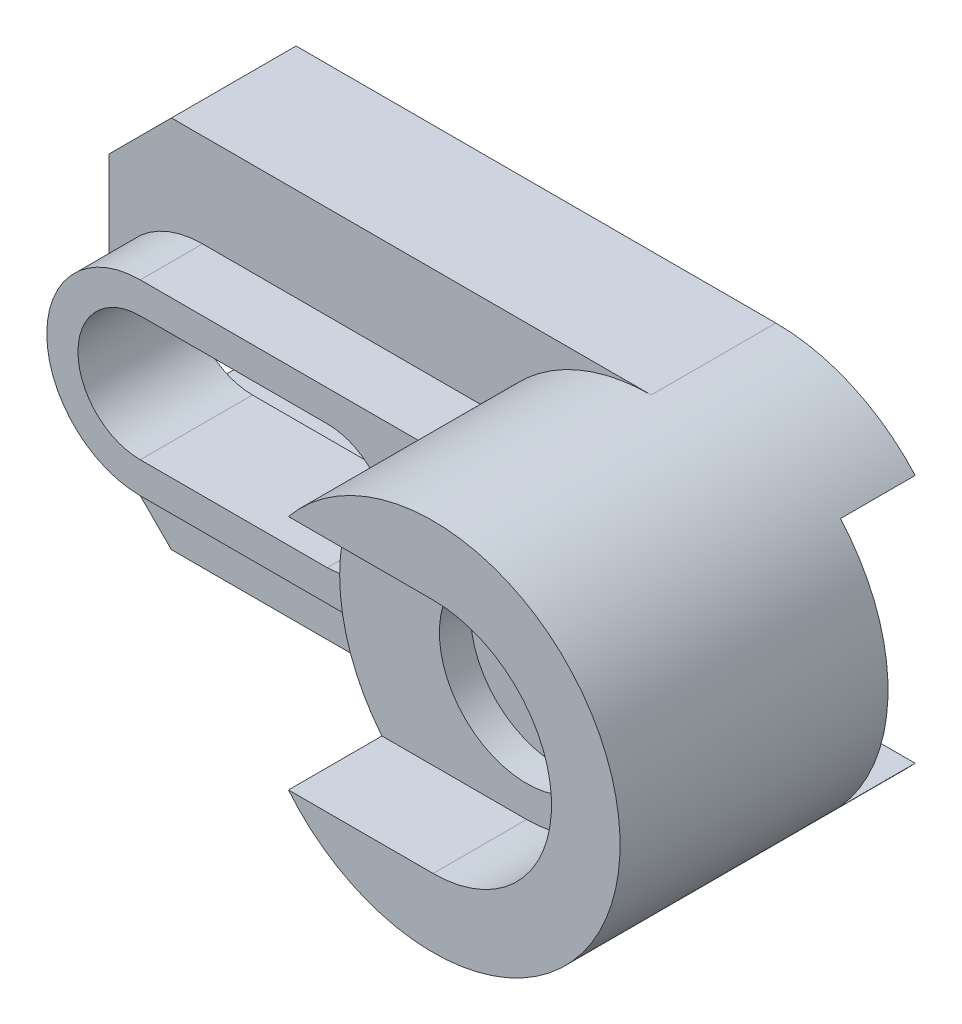
ISO-10303-21;
HEADER;
FILE_DESCRIPTION(('STEP AP214'),'2;1');
FILE_NAME('part.step','',(''),(''),'','','');
FILE_SCHEMA(('AUTOMOTIVE_DESIGN { 1 0 10303 214 1 1 1 1 }'));
ENDSEC;
DATA;
#1=APPLICATION_CONTEXT('core data for automotive mechanical design processes');
#2=APPLICATION_PROTOCOL_DEFINITION('international standard','automotive_design',2000,#1);
#3=PRODUCT_CONTEXT('',#1,'mechanical');
#4=PRODUCT('Part','Part','',(#3));
#5=PRODUCT_RELATED_PRODUCT_CATEGORY('part','',(#4));
#6=PRODUCT_DEFINITION_FORMATION('','',#4);
#7=PRODUCT_DEFINITION_CONTEXT('part definition',#1,'design');
#8=PRODUCT_DEFINITION('design','',#6,#7);
#9=PRODUCT_DEFINITION_SHAPE('','',#8);
#10=(LENGTH_UNIT() NAMED_UNIT(*) SI_UNIT(.MILLI.,.METRE.));
#11=(NAMED_UNIT(*) PLANE_ANGLE_UNIT() SI_UNIT($,.RADIAN.));
#12=(NAMED_UNIT(*) SI_UNIT($,.STERADIAN.) SOLID_ANGLE_UNIT());
#13=UNCERTAINTY_MEASURE_WITH_UNIT(LENGTH_MEASURE(1.E-05),#10,'distance_accuracy_value','');
#14=(GEOMETRIC_REPRESENTATION_CONTEXT(3) GLOBAL_UNCERTAINTY_ASSIGNED_CONTEXT((#13)) GLOBAL_UNIT_ASSIGNED_CONTEXT((#10,
#11,#12)) REPRESENTATION_CONTEXT('',''));
#15=CARTESIAN_POINT('',(0.,0.,0.));
#16=DIRECTION('',(0.,0.,1.));
#17=DIRECTION('',(1.,0.,0.));
#18=AXIS2_PLACEMENT_3D('',#15,#16,#17);
#19=CARTESIAN_POINT('',(0.,0.,-55.));
#20=DIRECTION('',(0.,0.,1.));
#21=DIRECTION('',(1.,0.,0.));
#22=AXIS2_PLACEMENT_3D('',#19,#20,#21);
#23=PLANE('',#22);
#24=DIRECTION('',(0.707106781186546,-0.70710678118655,0.));
#25=VECTOR('',#24,1.);
#26=CARTESIAN_POINT('',(-77.,-30.,-55.));
#27=LINE('',#26,#25);
#28=CARTESIAN_POINT('',(-77.,-30.,-55.));
#29=VERTEX_POINT('',#28);
#30=CARTESIAN_POINT('',(-87.,-20.,-55.));
#31=VERTEX_POINT('',#30);
#32=EDGE_CURVE('E248',#29,#31,#27,.F.);
#33=ORIENTED_EDGE('',*,*,#32,.T.);
#34=DIRECTION('',(-1.,0.,0.));
#35=VECTOR('',#34,1.);
#36=CARTESIAN_POINT('',(37.0000000000001,-20.,-55.));
#37=LINE('',#36,#35);
#38=CARTESIAN_POINT('',(22.3606797749979,-20.,-55.));
#39=VERTEX_POINT('',#38);
#40=EDGE_CURVE('E446',#39,#31,#37,.T.);
#41=ORIENTED_EDGE('',*,*,#40,.F.);
#42=CARTESIAN_POINT('',(0.,0.,-55.));
#43=DIRECTION('',(0.,0.,1.));
#44=DIRECTION('',(1.,0.,0.));
#45=AXIS2_PLACEMENT_3D('',#42,#43,#44);
#46=CIRCLE('',#45,30.);
#47=CARTESIAN_POINT('',(0.,-30.,-55.));
#48=VERTEX_POINT('',#47);
#49=EDGE_CURVE('E362',#48,#39,#46,.T.);
#50=ORIENTED_EDGE('',*,*,#49,.F.);
#51=DIRECTION('',(-1.,0.,0.));
#52=VECTOR('',#51,1.);
#53=CARTESIAN_POINT('',(-87.,-30.,-55.));
#54=LINE('',#53,#52);
#55=EDGE_CURVE('E330',#48,#29,#54,.T.);
#56=ORIENTED_EDGE('',*,*,#55,.T.);
#57=EDGE_LOOP('',(#33,#41,#50,#56));
#58=FACE_BOUND('',#57,.T.);
#59=ADVANCED_FACE('F41',(#58),#23,.F.);
#60=CARTESIAN_POINT('',(0.,0.,-55.));
#61=DIRECTION('',(0.,0.,1.));
#62=DIRECTION('',(1.,0.,0.));
#63=AXIS2_PLACEMENT_3D('',#60,#61,#62);
#64=CYLINDRICAL_SURFACE('',#63,30.);
#65=DIRECTION('',(0.,0.,1.));
#66=VECTOR('',#65,1.);
#67=CARTESIAN_POINT('',(22.3606797749979,-20.,-55.));
#68=LINE('',#67,#66);
#69=CARTESIAN_POINT('',(22.3606797749979,-20.,-43.));
#70=VERTEX_POINT('',#69);
#71=EDGE_CURVE('E447',#70,#39,#68,.F.);
#72=ORIENTED_EDGE('',*,*,#71,.F.);
#73=CARTESIAN_POINT('',(0.,0.,-43.));
#74=DIRECTION('',(0.,0.,1.));
#75=DIRECTION('',(0.,-1.,0.));
#76=AXIS2_PLACEMENT_3D('',#73,#74,#75);
#77=CIRCLE('',#76,30.);
#78=CARTESIAN_POINT('',(22.360679774998,19.9999999999999,-43.));
#79=VERTEX_POINT('',#78);
#80=EDGE_CURVE('E448',#79,#70,#77,.F.);
#81=ORIENTED_EDGE('',*,*,#80,.F.);
#82=DIRECTION('',(0.,0.,1.));
#83=VECTOR('',#82,1.);
#84=CARTESIAN_POINT('',(22.360679774998,19.9999999999999,-55.));
#85=LINE('',#84,#83);
#86=CARTESIAN_POINT('',(22.360679774998,19.9999999999999,-55.));
#87=VERTEX_POINT('',#86);
#88=EDGE_CURVE('E195',#87,#79,#85,.T.);
#89=ORIENTED_EDGE('',*,*,#88,.F.);
#90=CARTESIAN_POINT('',(0.,30.,-55.));
#91=VERTEX_POINT('',#90);
#92=EDGE_CURVE('E366',#87,#91,#46,.T.);
#93=ORIENTED_EDGE('',*,*,#92,.T.);
#94=DIRECTION('',(0.,0.,-1.));
#95=VECTOR('',#94,1.);
#96=CARTESIAN_POINT('',(0.,30.,-35.));
#97=LINE('',#96,#95);
#98=CARTESIAN_POINT('',(0.,30.,-35.));
#99=VERTEX_POINT('',#98);
#100=EDGE_CURVE('E354',#99,#91,#97,.T.);
#101=ORIENTED_EDGE('',*,*,#100,.F.);
#102=CARTESIAN_POINT('',(0.,0.,-35.));
#103=DIRECTION('',(0.,0.,1.));
#104=DIRECTION('',(-1.,0.,0.));
#105=AXIS2_PLACEMENT_3D('',#102,#103,#104);
#106=CIRCLE('',#105,30.);
#107=CARTESIAN_POINT('',(-25.9807621135332,15.,-35.));
#108=VERTEX_POINT('',#107);
#109=EDGE_CURVE('E331',#99,#108,#106,.T.);
#110=ORIENTED_EDGE('',*,*,#109,.T.);
#111=DIRECTION('',(0.,0.,-1.));
#112=VECTOR('',#111,1.);
#113=CARTESIAN_POINT('',(-25.9807621135332,15.,-25.));
#114=LINE('',#113,#112);
#115=CARTESIAN_POINT('',(-25.9807621135332,15.,-25.));
#116=VERTEX_POINT('',#115);
#117=EDGE_CURVE('E288',#116,#108,#114,.T.);
#118=ORIENTED_EDGE('',*,*,#117,.F.);
#119=CARTESIAN_POINT('',(0.,0.,-25.));
#120=DIRECTION('',(0.,0.,-1.));
#121=DIRECTION('',(1.,0.,0.));
#122=AXIS2_PLACEMENT_3D('',#119,#120,#121);
#123=CIRCLE('',#122,30.);
#124=CARTESIAN_POINT('',(-25.9807621135332,-15.,-25.));
#125=VERTEX_POINT('',#124);
#126=EDGE_CURVE('E490',#125,#116,#123,.T.);
#127=ORIENTED_EDGE('',*,*,#126,.F.);
#128=DIRECTION('',(0.,0.,-1.));
#129=VECTOR('',#128,1.);
#130=CARTESIAN_POINT('',(-25.9807621135332,-15.,-25.));
#131=LINE('',#130,#129);
#132=CARTESIAN_POINT('',(-25.9807621135332,-15.,-35.));
#133=VERTEX_POINT('',#132);
#134=EDGE_CURVE('E281',#125,#133,#131,.T.);
#135=ORIENTED_EDGE('',*,*,#134,.T.);
#136=CARTESIAN_POINT('',(0.,-30.,-35.));
#137=VERTEX_POINT('',#136);
#138=EDGE_CURVE('E336',#133,#137,#106,.T.);
#139=ORIENTED_EDGE('',*,*,#138,.T.);
#140=DIRECTION('',(0.,0.,-1.));
#141=VECTOR('',#140,1.);
#142=CARTESIAN_POINT('',(0.,-30.,-35.));
#143=LINE('',#142,#141);
#144=EDGE_CURVE('E346',#137,#48,#143,.T.);
#145=ORIENTED_EDGE('',*,*,#144,.T.);
#146=ORIENTED_EDGE('',*,*,#49,.T.);
#147=EDGE_LOOP('',(#72,#81,#89,#93,#101,#110,#118,#127,#135,#139,#145,#146));
#148=FACE_BOUND('',#147,.T.);
#149=DIRECTION('',(0.,0.,1.));
#150=VECTOR('',#149,1.);
#151=CARTESIAN_POINT('',(-23.2163735324878,-19.,-55.));
#152=LINE('',#151,#150);
#153=CARTESIAN_POINT('',(-23.2163735324878,-19.,-15.));
#154=VERTEX_POINT('',#153);
#155=CARTESIAN_POINT('',(-23.2163735324878,-19.,0.));
#156=VERTEX_POINT('',#155);
#157=EDGE_CURVE('E327',#154,#156,#152,.T.);
#158=ORIENTED_EDGE('',*,*,#157,.F.);
#159=CARTESIAN_POINT('',(0.,0.,-15.));
#160=DIRECTION('',(0.,0.,1.));
#161=DIRECTION('',(1.,0.,0.));
#162=AXIS2_PLACEMENT_3D('',#159,#160,#161);
#163=CIRCLE('',#162,30.);
#164=CARTESIAN_POINT('',(-23.2163735324878,19.,-15.));
#165=VERTEX_POINT('',#164);
#166=EDGE_CURVE('E228',#154,#165,#163,.F.);
#167=ORIENTED_EDGE('',*,*,#166,.T.);
#168=DIRECTION('',(0.,0.,1.));
#169=VECTOR('',#168,1.);
#170=CARTESIAN_POINT('',(-23.2163735324878,19.,-55.));
#171=LINE('',#170,#169);
#172=CARTESIAN_POINT('',(-23.2163735324878,19.,0.));
#173=VERTEX_POINT('',#172);
#174=EDGE_CURVE('E321',#173,#165,#171,.F.);
#175=ORIENTED_EDGE('',*,*,#174,.F.);
#176=CARTESIAN_POINT('',(0.,0.,0.));
#177=DIRECTION('',(0.,0.,1.));
#178=DIRECTION('',(1.,0.,0.));
#179=AXIS2_PLACEMENT_3D('',#176,#177,#178);
#180=CIRCLE('',#179,30.);
#181=EDGE_CURVE('E358',#156,#173,#180,.T.);
#182=ORIENTED_EDGE('',*,*,#181,.F.);
#183=EDGE_LOOP('',(#158,#167,#175,#182));
#184=FACE_BOUND('',#183,.T.);
#185=ADVANCED_FACE('F389',(#148,#184),#64,.T.);
#186=CARTESIAN_POINT('',(0.,0.,-35.));
#187=DIRECTION('',(0.,0.,-1.));
#188=DIRECTION('',(-1.,0.,0.));
#189=AXIS2_PLACEMENT_3D('',#186,#187,#188);
#190=PLANE('',#189);
#191=DIRECTION('',(1.,0.,0.));
#192=VECTOR('',#191,1.);
#193=CARTESIAN_POINT('',(-72.,-15.,-35.));
#194=LINE('',#193,#192);
#195=CARTESIAN_POINT('',(-72.,-15.,-35.));
#196=VERTEX_POINT('',#195);
#197=EDGE_CURVE('E275',#196,#133,#194,.T.);
#198=ORIENTED_EDGE('',*,*,#197,.F.);
#199=CARTESIAN_POINT('',(-72.,0.,-35.));
#200=DIRECTION('',(0.,0.,-1.));
#201=DIRECTION('',(-1.,0.,0.));
#202=AXIS2_PLACEMENT_3D('',#199,#200,#201);
#203=CIRCLE('',#202,15.);
#204=CARTESIAN_POINT('',(-87.,0.,-35.));
#205=VERTEX_POINT('',#204);
#206=EDGE_CURVE('E51',#205,#196,#203,.F.);
#207=ORIENTED_EDGE('',*,*,#206,.F.);
#208=DIRECTION('',(0.,1.,0.));
#209=VECTOR('',#208,1.);
#210=CARTESIAN_POINT('',(-87.,30.,-35.));
#211=LINE('',#210,#209);
#212=CARTESIAN_POINT('',(-87.,-20.,-35.));
#213=VERTEX_POINT('',#212);
#214=EDGE_CURVE('E340',#213,#205,#211,.T.);
#215=ORIENTED_EDGE('',*,*,#214,.F.);
#216=DIRECTION('',(-0.707106781186546,0.70710678118655,0.));
#217=VECTOR('',#216,1.);
#218=CARTESIAN_POINT('',(-77.,-30.,-35.));
#219=LINE('',#218,#217);
#220=CARTESIAN_POINT('',(-77.,-30.,-35.));
#221=VERTEX_POINT('',#220);
#222=EDGE_CURVE('E256',#213,#221,#219,.F.);
#223=ORIENTED_EDGE('',*,*,#222,.T.);
#224=DIRECTION('',(-1.,0.,0.));
#225=VECTOR('',#224,1.);
#226=CARTESIAN_POINT('',(-87.,-30.,-35.));
#227=LINE('',#226,#225);
#228=EDGE_CURVE('E335',#137,#221,#227,.T.);
#229=ORIENTED_EDGE('',*,*,#228,.F.);
#230=ORIENTED_EDGE('',*,*,#138,.F.);
#231=EDGE_LOOP('',(#198,#207,#215,#223,#229,#230));
#232=FACE_BOUND('',#231,.T.);
#233=ADVANCED_FACE('F413',(#232),#190,.F.);
#234=CARTESIAN_POINT('',(-72.,0.,-35.));
#235=DIRECTION('',(0.,0.,1.));
#236=DIRECTION('',(1.,0.,0.));
#237=AXIS2_PLACEMENT_3D('',#234,#235,#236);
#238=CIRCLE('',#237,15.);
#239=CARTESIAN_POINT('',(-72.,15.,-35.));
#240=VERTEX_POINT('',#239);
#241=EDGE_CURVE('E268',#240,#205,#238,.T.);
#242=ORIENTED_EDGE('',*,*,#241,.F.);
#243=DIRECTION('',(-1.,0.,0.));
#244=VECTOR('',#243,1.);
#245=CARTESIAN_POINT('',(-72.,15.,-35.));
#246=LINE('',#245,#244);
#247=EDGE_CURVE('E487',#108,#240,#246,.T.);
#248=ORIENTED_EDGE('',*,*,#247,.F.);
#249=ORIENTED_EDGE('',*,*,#109,.F.);
#250=DIRECTION('',(1.,0.,0.));
#251=VECTOR('',#250,1.);
#252=CARTESIAN_POINT('',(0.,30.,-35.));
#253=LINE('',#252,#251);
#254=CARTESIAN_POINT('',(-77.,30.,-35.));
#255=VERTEX_POINT('',#254);
#256=EDGE_CURVE('E343',#255,#99,#253,.T.);
#257=ORIENTED_EDGE('',*,*,#256,.F.);
#258=DIRECTION('',(0.707106781186548,0.707106781186547,0.));
#259=VECTOR('',#258,1.);
#260=CARTESIAN_POINT('',(-87.,20.,-35.));
#261=LINE('',#260,#259);
#262=CARTESIAN_POINT('',(-87.,20.,-35.));
#263=VERTEX_POINT('',#262);
#264=EDGE_CURVE('E241',#255,#263,#261,.F.);
#265=ORIENTED_EDGE('',*,*,#264,.T.);
#266=EDGE_CURVE('E225',#205,#263,#211,.T.);
#267=ORIENTED_EDGE('',*,*,#266,.F.);
#268=EDGE_LOOP('',(#242,#248,#249,#257,#265,#267));
#269=FACE_BOUND('',#268,.T.);
#270=ADVANCED_FACE('F419',(#269),#190,.F.);
#271=ORIENTED_EDGE('',*,*,#92,.F.);
#272=DIRECTION('',(-1.,0.,0.));
#273=VECTOR('',#272,1.);
#274=CARTESIAN_POINT('',(37.0000000000001,19.9999999999999,-55.));
#275=LINE('',#274,#273);
#276=CARTESIAN_POINT('',(-87.,20.,-55.));
#277=VERTEX_POINT('',#276);
#278=EDGE_CURVE('E199',#87,#277,#275,.T.);
#279=ORIENTED_EDGE('',*,*,#278,.T.);
#280=DIRECTION('',(-0.707106781186548,-0.707106781186547,0.));
#281=VECTOR('',#280,1.);
#282=CARTESIAN_POINT('',(-87.,20.,-55.));
#283=LINE('',#282,#281);
#284=CARTESIAN_POINT('',(-77.,30.,-55.));
#285=VERTEX_POINT('',#284);
#286=EDGE_CURVE('E219',#277,#285,#283,.F.);
#287=ORIENTED_EDGE('',*,*,#286,.T.);
#288=DIRECTION('',(1.,0.,0.));
#289=VECTOR('',#288,1.);
#290=CARTESIAN_POINT('',(0.,30.,-55.));
#291=LINE('',#290,#289);
#292=EDGE_CURVE('E350',#285,#91,#291,.T.);
#293=ORIENTED_EDGE('',*,*,#292,.T.);
#294=EDGE_LOOP('',(#271,#279,#287,#293));
#295=FACE_BOUND('',#294,.T.);
#296=ADVANCED_FACE('F409',(#295),#23,.F.);
#297=CARTESIAN_POINT('',(0.,0.,0.));
#298=DIRECTION('',(0.,0.,1.));
#299=DIRECTION('',(1.,0.,0.));
#300=AXIS2_PLACEMENT_3D('',#297,#298,#299);
#301=PLANE('',#300);
#302=DIRECTION('',(1.,0.,0.));
#303=VECTOR('',#302,1.);
#304=CARTESIAN_POINT('',(0.,-19.,0.));
#305=LINE('',#304,#303);
#306=CARTESIAN_POINT('',(0.,-19.,0.));
#307=VERTEX_POINT('',#306);
#308=EDGE_CURVE('E235',#156,#307,#305,.T.);
#309=ORIENTED_EDGE('',*,*,#308,.F.);
#310=ORIENTED_EDGE('',*,*,#181,.T.);
#311=DIRECTION('',(-1.,0.,0.));
#312=VECTOR('',#311,1.);
#313=CARTESIAN_POINT('',(0.,19.,0.));
#314=LINE('',#313,#312);
#315=CARTESIAN_POINT('',(0.,19.,0.));
#316=VERTEX_POINT('',#315);
#317=EDGE_CURVE('E305',#316,#173,#314,.T.);
#318=ORIENTED_EDGE('',*,*,#317,.F.);
#319=CARTESIAN_POINT('',(0.,0.,0.));
#320=DIRECTION('',(0.,0.,1.));
#321=DIRECTION('',(1.,0.,0.));
#322=AXIS2_PLACEMENT_3D('',#319,#320,#321);
#323=CIRCLE('',#322,19.);
#324=EDGE_CURVE('E296',#307,#316,#323,.T.);
#325=ORIENTED_EDGE('',*,*,#324,.F.);
#326=EDGE_LOOP('',(#309,#310,#318,#325));
#327=FACE_BOUND('',#326,.T.);
#328=ADVANCED_FACE('F383',(#327),#301,.T.);
#329=CARTESIAN_POINT('',(0.,30.,-35.));
#330=DIRECTION('',(0.,1.,0.));
#331=DIRECTION('',(0.,0.,1.));
#332=AXIS2_PLACEMENT_3D('',#329,#330,#331);
#333=PLANE('',#332);
#334=ORIENTED_EDGE('',*,*,#292,.F.);
#335=DIRECTION('',(0.,0.,1.));
#336=VECTOR('',#335,1.);
#337=CARTESIAN_POINT('',(-77.,30.,-35.));
#338=LINE('',#337,#336);
#339=EDGE_CURVE('E232',#285,#255,#338,.T.);
#340=ORIENTED_EDGE('',*,*,#339,.T.);
#341=ORIENTED_EDGE('',*,*,#256,.T.);
#342=ORIENTED_EDGE('',*,*,#100,.T.);
#343=EDGE_LOOP('',(#334,#340,#341,#342));
#344=FACE_BOUND('',#343,.T.);
#345=ADVANCED_FACE('F425',(#344),#333,.T.);
#346=CARTESIAN_POINT('',(-87.,30.,-35.));
#347=DIRECTION('',(-1.,0.,0.));
#348=DIRECTION('',(0.,-1.,0.));
#349=AXIS2_PLACEMENT_3D('',#346,#347,#348);
#350=PLANE('',#349);
#351=DIRECTION('',(0.,1.,0.));
#352=VECTOR('',#351,1.);
#353=CARTESIAN_POINT('',(-87.,20.,-43.));
#354=LINE('',#353,#352);
#355=CARTESIAN_POINT('',(-87.,-20.,-43.));
#356=VERTEX_POINT('',#355);
#357=CARTESIAN_POINT('',(-87.,20.,-43.));
#358=VERTEX_POINT('',#357);
#359=EDGE_CURVE('E202',#356,#358,#354,.T.);
#360=ORIENTED_EDGE('',*,*,#359,.F.);
#361=DIRECTION('',(0.,0.,1.));
#362=VECTOR('',#361,1.);
#363=CARTESIAN_POINT('',(-87.,-20.,-35.));
#364=LINE('',#363,#362);
#365=EDGE_CURVE('E252',#356,#213,#364,.T.);
#366=ORIENTED_EDGE('',*,*,#365,.T.);
#367=ORIENTED_EDGE('',*,*,#214,.T.);
#368=ORIENTED_EDGE('',*,*,#266,.T.);
#369=DIRECTION('',(0.,0.,-1.));
#370=VECTOR('',#369,1.);
#371=CARTESIAN_POINT('',(-87.,20.,-35.));
#372=LINE('',#371,#370);
#373=EDGE_CURVE('E217',#263,#358,#372,.T.);
#374=ORIENTED_EDGE('',*,*,#373,.T.);
#375=EDGE_LOOP('',(#360,#366,#367,#368,#374));
#376=FACE_BOUND('',#375,.T.);
#377=ADVANCED_FACE('F222',(#376),#350,.T.);
#378=CARTESIAN_POINT('',(-87.,-30.,-35.));
#379=DIRECTION('',(0.,-1.,0.));
#380=DIRECTION('',(0.,0.,-1.));
#381=AXIS2_PLACEMENT_3D('',#378,#379,#380);
#382=PLANE('',#381);
#383=ORIENTED_EDGE('',*,*,#228,.T.);
#384=DIRECTION('',(0.,0.,-1.));
#385=VECTOR('',#384,1.);
#386=CARTESIAN_POINT('',(-77.,-30.,-35.));
#387=LINE('',#386,#385);
#388=EDGE_CURVE('E244',#221,#29,#387,.T.);
#389=ORIENTED_EDGE('',*,*,#388,.T.);
#390=ORIENTED_EDGE('',*,*,#55,.F.);
#391=ORIENTED_EDGE('',*,*,#144,.F.);
#392=EDGE_LOOP('',(#383,#389,#390,#391));
#393=FACE_BOUND('',#392,.T.);
#394=ADVANCED_FACE('F440',(#393),#382,.T.);
#395=CARTESIAN_POINT('',(0.,0.,-15.));
#396=DIRECTION('',(0.,0.,1.));
#397=DIRECTION('',(1.,0.,0.));
#398=AXIS2_PLACEMENT_3D('',#395,#396,#397);
#399=CYLINDRICAL_SURFACE('',#398,19.);
#400=ORIENTED_EDGE('',*,*,#324,.T.);
#401=DIRECTION('',(0.,0.,1.));
#402=VECTOR('',#401,1.);
#403=CARTESIAN_POINT('',(0.,19.,-15.));
#404=LINE('',#403,#402);
#405=CARTESIAN_POINT('',(0.,19.,-15.));
#406=VERTEX_POINT('',#405);
#407=EDGE_CURVE('E312',#406,#316,#404,.T.);
#408=ORIENTED_EDGE('',*,*,#407,.F.);
#409=CARTESIAN_POINT('',(0.,0.,-15.));
#410=DIRECTION('',(0.,0.,1.));
#411=DIRECTION('',(1.,0.,0.));
#412=AXIS2_PLACEMENT_3D('',#409,#410,#411);
#413=CIRCLE('',#412,19.);
#414=CARTESIAN_POINT('',(0.,-19.,-15.));
#415=VERTEX_POINT('',#414);
#416=EDGE_CURVE('E300',#415,#406,#413,.T.);
#417=ORIENTED_EDGE('',*,*,#416,.F.);
#418=DIRECTION('',(0.,0.,1.));
#419=VECTOR('',#418,1.);
#420=CARTESIAN_POINT('',(0.,-19.,-15.));
#421=LINE('',#420,#419);
#422=EDGE_CURVE('E317',#415,#307,#421,.T.);
#423=ORIENTED_EDGE('',*,*,#422,.T.);
#424=EDGE_LOOP('',(#400,#408,#417,#423));
#425=FACE_BOUND('',#424,.T.);
#426=ADVANCED_FACE('F381',(#425),#399,.F.);
#427=CARTESIAN_POINT('',(0.,-19.,-15.));
#428=DIRECTION('',(0.,-1.,0.));
#429=DIRECTION('',(0.,0.,-1.));
#430=AXIS2_PLACEMENT_3D('',#427,#428,#429);
#431=PLANE('',#430);
#432=ORIENTED_EDGE('',*,*,#157,.T.);
#433=ORIENTED_EDGE('',*,*,#308,.T.);
#434=ORIENTED_EDGE('',*,*,#422,.F.);
#435=DIRECTION('',(1.,0.,0.));
#436=VECTOR('',#435,1.);
#437=CARTESIAN_POINT('',(0.,-19.,-15.));
#438=LINE('',#437,#436);
#439=EDGE_CURVE('E309',#154,#415,#438,.T.);
#440=ORIENTED_EDGE('',*,*,#439,.F.);
#441=EDGE_LOOP('',(#432,#433,#434,#440));
#442=FACE_BOUND('',#441,.T.);
#443=ADVANCED_FACE('F373',(#442),#431,.F.);
#444=CARTESIAN_POINT('',(0.,19.,-15.));
#445=DIRECTION('',(0.,1.,0.));
#446=DIRECTION('',(0.,0.,1.));
#447=AXIS2_PLACEMENT_3D('',#444,#445,#446);
#448=PLANE('',#447);
#449=ORIENTED_EDGE('',*,*,#174,.T.);
#450=DIRECTION('',(-1.,0.,0.));
#451=VECTOR('',#450,1.);
#452=CARTESIAN_POINT('',(0.,19.,-15.));
#453=LINE('',#452,#451);
#454=EDGE_CURVE('E304',#406,#165,#453,.T.);
#455=ORIENTED_EDGE('',*,*,#454,.F.);
#456=ORIENTED_EDGE('',*,*,#407,.T.);
#457=ORIENTED_EDGE('',*,*,#317,.T.);
#458=EDGE_LOOP('',(#449,#455,#456,#457));
#459=FACE_BOUND('',#458,.T.);
#460=ADVANCED_FACE('F386',(#459),#448,.F.);
#461=CARTESIAN_POINT('',(0.,0.,-15.));
#462=DIRECTION('',(0.,0.,1.));
#463=DIRECTION('',(1.,0.,0.));
#464=AXIS2_PLACEMENT_3D('',#461,#462,#463);
#465=PLANE('',#464);
#466=CARTESIAN_POINT('',(0.,0.,-15.));
#467=DIRECTION('',(0.,0.,1.));
#468=DIRECTION('',(1.,0.,0.));
#469=AXIS2_PLACEMENT_3D('',#466,#467,#468);
#470=CIRCLE('',#469,14.);
#471=CARTESIAN_POINT('',(14.,0.,-15.));
#472=VERTEX_POINT('',#471);
#473=EDGE_CURVE('E286',#472,#472,#470,.T.);
#474=ORIENTED_EDGE('',*,*,#473,.F.);
#475=EDGE_LOOP('',(#474));
#476=FACE_BOUND('',#475,.T.);
#477=ORIENTED_EDGE('',*,*,#439,.T.);
#478=ORIENTED_EDGE('',*,*,#416,.T.);
#479=ORIENTED_EDGE('',*,*,#454,.T.);
#480=ORIENTED_EDGE('',*,*,#166,.F.);
#481=EDGE_LOOP('',(#477,#478,#479,#480));
#482=FACE_BOUND('',#481,.T.);
#483=ADVANCED_FACE('F391',(#476,#482),#465,.T.);
#484=CARTESIAN_POINT('',(0.,0.,-20.));
#485=DIRECTION('',(0.,0.,1.));
#486=DIRECTION('',(1.,0.,0.));
#487=AXIS2_PLACEMENT_3D('',#484,#485,#486);
#488=CYLINDRICAL_SURFACE('',#487,14.);
#489=CARTESIAN_POINT('',(0.,0.,-20.));
#490=DIRECTION('',(0.,0.,1.));
#491=DIRECTION('',(1.,0.,0.));
#492=AXIS2_PLACEMENT_3D('',#489,#490,#491);
#493=CIRCLE('',#492,14.);
#494=CARTESIAN_POINT('',(14.,0.,-20.));
#495=VERTEX_POINT('',#494);
#496=EDGE_CURVE('E292',#495,#495,#493,.T.);
#497=ORIENTED_EDGE('',*,*,#496,.F.);
#498=EDGE_LOOP('',(#497));
#499=FACE_BOUND('',#498,.T.);
#500=ORIENTED_EDGE('',*,*,#473,.T.);
#501=EDGE_LOOP('',(#500));
#502=FACE_BOUND('',#501,.T.);
#503=ADVANCED_FACE('F393',(#499,#502),#488,.F.);
#504=CARTESIAN_POINT('',(0.,0.,-20.));
#505=DIRECTION('',(0.,0.,1.));
#506=DIRECTION('',(1.,0.,0.));
#507=AXIS2_PLACEMENT_3D('',#504,#505,#506);
#508=PLANE('',#507);
#509=CARTESIAN_POINT('',(0.167448048305153,0.0424846597410035,-20.));
#510=DIRECTION('',(0.,0.,1.));
#511=DIRECTION('',(1.,0.,0.));
#512=AXIS2_PLACEMENT_3D('',#509,#510,#511);
#513=CIRCLE('',#512,6.);
#514=CARTESIAN_POINT('',(6.16744804830515,0.0424846597410035,-20.));
#515=VERTEX_POINT('',#514);
#516=EDGE_CURVE('E280',#515,#515,#513,.T.);
#517=ORIENTED_EDGE('',*,*,#516,.F.);
#518=EDGE_LOOP('',(#517));
#519=FACE_BOUND('',#518,.T.);
#520=ORIENTED_EDGE('',*,*,#496,.T.);
#521=EDGE_LOOP('',(#520));
#522=FACE_BOUND('',#521,.T.);
#523=ADVANCED_FACE('F400',(#519,#522),#508,.T.);
#524=CARTESIAN_POINT('',(0.167448048305153,0.0424846597410035,-85.));
#525=DIRECTION('',(0.,0.,1.));
#526=DIRECTION('',(1.,0.,0.));
#527=AXIS2_PLACEMENT_3D('',#524,#525,#526);
#528=CYLINDRICAL_SURFACE('',#527,6.);
#529=CARTESIAN_POINT('',(0.167448048305153,0.0424846597410035,-43.));
#530=DIRECTION('',(0.,0.,1.));
#531=DIRECTION('',(0.,-1.,0.));
#532=AXIS2_PLACEMENT_3D('',#529,#530,#531);
#533=CIRCLE('',#532,6.);
#534=CARTESIAN_POINT('',(0.167448048305153,-5.957515340259,-43.));
#535=VERTEX_POINT('',#534);
#536=EDGE_CURVE('E456',#535,#535,#533,.F.);
#537=ORIENTED_EDGE('',*,*,#536,.T.);
#538=EDGE_LOOP('',(#537));
#539=FACE_BOUND('',#538,.T.);
#540=ORIENTED_EDGE('',*,*,#516,.T.);
#541=EDGE_LOOP('',(#540));
#542=FACE_BOUND('',#541,.T.);
#543=ADVANCED_FACE('F534',(#539,#542),#528,.F.);
#544=CARTESIAN_POINT('',(-87.,20.,-35.));
#545=DIRECTION('',(0.707106781186547,-0.707106781186548,0.));
#546=DIRECTION('',(0.,0.,-1.));
#547=AXIS2_PLACEMENT_3D('',#544,#545,#546);
#548=PLANE('',#547);
#549=ORIENTED_EDGE('',*,*,#264,.F.);
#550=ORIENTED_EDGE('',*,*,#339,.F.);
#551=ORIENTED_EDGE('',*,*,#286,.F.);
#552=DIRECTION('',(0.,0.,-1.));
#553=VECTOR('',#552,1.);
#554=CARTESIAN_POINT('',(-87.,20.,-43.));
#555=LINE('',#554,#553);
#556=EDGE_CURVE('E192',#358,#277,#555,.T.);
#557=ORIENTED_EDGE('',*,*,#556,.F.);
#558=ORIENTED_EDGE('',*,*,#373,.F.);
#559=EDGE_LOOP('',(#549,#550,#551,#557,#558));
#560=FACE_BOUND('',#559,.T.);
#561=ADVANCED_FACE('F216',(#560),#548,.F.);
#562=CARTESIAN_POINT('',(-77.,-30.,-35.));
#563=DIRECTION('',(0.70710678118655,0.707106781186546,0.));
#564=DIRECTION('',(0.,0.,-1.));
#565=AXIS2_PLACEMENT_3D('',#562,#563,#564);
#566=PLANE('',#565);
#567=ORIENTED_EDGE('',*,*,#222,.F.);
#568=ORIENTED_EDGE('',*,*,#365,.F.);
#569=EDGE_CURVE('E253',#31,#356,#364,.T.);
#570=ORIENTED_EDGE('',*,*,#569,.F.);
#571=ORIENTED_EDGE('',*,*,#32,.F.);
#572=ORIENTED_EDGE('',*,*,#388,.F.);
#573=EDGE_LOOP('',(#567,#568,#570,#571,#572));
#574=FACE_BOUND('',#573,.T.);
#575=ADVANCED_FACE('F44',(#574),#566,.F.);
#576=CARTESIAN_POINT('',(-72.,0.,-25.));
#577=DIRECTION('',(0.,0.,-1.));
#578=DIRECTION('',(-1.,0.,0.));
#579=AXIS2_PLACEMENT_3D('',#576,#577,#578);
#580=CYLINDRICAL_SURFACE('',#579,15.);
#581=ORIENTED_EDGE('',*,*,#241,.T.);
#582=ORIENTED_EDGE('',*,*,#206,.T.);
#583=DIRECTION('',(0.,0.,-1.));
#584=VECTOR('',#583,1.);
#585=CARTESIAN_POINT('',(-72.,-15.,-25.));
#586=LINE('',#585,#584);
#587=CARTESIAN_POINT('',(-72.,-15.,-25.));
#588=VERTEX_POINT('',#587);
#589=EDGE_CURVE('E266',#588,#196,#586,.T.);
#590=ORIENTED_EDGE('',*,*,#589,.F.);
#591=CARTESIAN_POINT('',(-72.,0.,-25.));
#592=DIRECTION('',(0.,0.,1.));
#593=DIRECTION('',(1.,0.,0.));
#594=AXIS2_PLACEMENT_3D('',#591,#592,#593);
#595=CIRCLE('',#594,15.);
#596=CARTESIAN_POINT('',(-72.,15.,-25.));
#597=VERTEX_POINT('',#596);
#598=EDGE_CURVE('E484',#597,#588,#595,.T.);
#599=ORIENTED_EDGE('',*,*,#598,.F.);
#600=DIRECTION('',(0.,0.,-1.));
#601=VECTOR('',#600,1.);
#602=CARTESIAN_POINT('',(-72.,15.,-25.));
#603=LINE('',#602,#601);
#604=EDGE_CURVE('E497',#597,#240,#603,.T.);
#605=ORIENTED_EDGE('',*,*,#604,.T.);
#606=EDGE_LOOP('',(#581,#582,#590,#599,#605));
#607=FACE_BOUND('',#606,.T.);
#608=ADVANCED_FACE('F264',(#607),#580,.T.);
#609=CARTESIAN_POINT('',(-72.,-15.,-25.));
#610=DIRECTION('',(0.,1.,0.));
#611=DIRECTION('',(0.,0.,1.));
#612=AXIS2_PLACEMENT_3D('',#609,#610,#611);
#613=PLANE('',#612);
#614=ORIENTED_EDGE('',*,*,#197,.T.);
#615=ORIENTED_EDGE('',*,*,#134,.F.);
#616=DIRECTION('',(1.,0.,0.));
#617=VECTOR('',#616,1.);
#618=CARTESIAN_POINT('',(-72.,-15.,-25.));
#619=LINE('',#618,#617);
#620=EDGE_CURVE('E277',#588,#125,#619,.T.);
#621=ORIENTED_EDGE('',*,*,#620,.F.);
#622=ORIENTED_EDGE('',*,*,#589,.T.);
#623=EDGE_LOOP('',(#614,#615,#621,#622));
#624=FACE_BOUND('',#623,.T.);
#625=ADVANCED_FACE('F273',(#624),#613,.F.);
#626=CARTESIAN_POINT('',(-72.,15.,-25.));
#627=DIRECTION('',(0.,-1.,0.));
#628=DIRECTION('',(0.,0.,-1.));
#629=AXIS2_PLACEMENT_3D('',#626,#627,#628);
#630=PLANE('',#629);
#631=ORIENTED_EDGE('',*,*,#247,.T.);
#632=ORIENTED_EDGE('',*,*,#604,.F.);
#633=DIRECTION('',(-1.,0.,0.));
#634=VECTOR('',#633,1.);
#635=CARTESIAN_POINT('',(-72.,15.,-25.));
#636=LINE('',#635,#634);
#637=EDGE_CURVE('E494',#116,#597,#636,.T.);
#638=ORIENTED_EDGE('',*,*,#637,.F.);
#639=ORIENTED_EDGE('',*,*,#117,.T.);
#640=EDGE_LOOP('',(#631,#632,#638,#639));
#641=FACE_BOUND('',#640,.T.);
#642=ADVANCED_FACE('F510',(#641),#630,.F.);
#643=CARTESIAN_POINT('',(-72.,0.,-25.));
#644=DIRECTION('',(0.,0.,1.));
#645=DIRECTION('',(1.,0.,0.));
#646=AXIS2_PLACEMENT_3D('',#643,#644,#645);
#647=PLANE('',#646);
#648=CARTESIAN_POINT('',(-72.,0.,-25.));
#649=DIRECTION('',(0.,0.,1.));
#650=DIRECTION('',(1.,0.,0.));
#651=AXIS2_PLACEMENT_3D('',#648,#649,#650);
#652=CIRCLE('',#651,9.99999999999999);
#653=CARTESIAN_POINT('',(-72.,9.99999999999999,-25.));
#654=VERTEX_POINT('',#653);
#655=CARTESIAN_POINT('',(-72.,-9.99999999999999,-25.));
#656=VERTEX_POINT('',#655);
#657=EDGE_CURVE('E454',#654,#656,#652,.T.);
#658=ORIENTED_EDGE('',*,*,#657,.F.);
#659=DIRECTION('',(-1.,0.,0.));
#660=VECTOR('',#659,1.);
#661=CARTESIAN_POINT('',(-72.,9.99999999999999,-25.));
#662=LINE('',#661,#660);
#663=CARTESIAN_POINT('',(-42.,10.,-25.));
#664=VERTEX_POINT('',#663);
#665=EDGE_CURVE('E469',#664,#654,#662,.T.);
#666=ORIENTED_EDGE('',*,*,#665,.F.);
#667=CARTESIAN_POINT('',(-42.,0.,-25.));
#668=DIRECTION('',(0.,0.,1.));
#669=DIRECTION('',(1.,0.,0.));
#670=AXIS2_PLACEMENT_3D('',#667,#668,#669);
#671=CIRCLE('',#670,10.);
#672=CARTESIAN_POINT('',(-42.,-10.,-25.));
#673=VERTEX_POINT('',#672);
#674=EDGE_CURVE('E465',#673,#664,#671,.T.);
#675=ORIENTED_EDGE('',*,*,#674,.F.);
#676=DIRECTION('',(1.,0.,0.));
#677=VECTOR('',#676,1.);
#678=CARTESIAN_POINT('',(-72.,-9.99999999999999,-25.));
#679=LINE('',#678,#677);
#680=EDGE_CURVE('E462',#656,#673,#679,.T.);
#681=ORIENTED_EDGE('',*,*,#680,.F.);
#682=EDGE_LOOP('',(#658,#666,#675,#681));
#683=FACE_BOUND('',#682,.T.);
#684=ORIENTED_EDGE('',*,*,#598,.T.);
#685=ORIENTED_EDGE('',*,*,#620,.T.);
#686=ORIENTED_EDGE('',*,*,#126,.T.);
#687=ORIENTED_EDGE('',*,*,#637,.T.);
#688=EDGE_LOOP('',(#684,#685,#686,#687));
#689=FACE_BOUND('',#688,.T.);
#690=ADVANCED_FACE('F514',(#683,#689),#647,.T.);
#691=CARTESIAN_POINT('',(-72.,0.,-79.0000000000001));
#692=DIRECTION('',(0.,0.,1.));
#693=DIRECTION('',(1.,0.,0.));
#694=AXIS2_PLACEMENT_3D('',#691,#692,#693);
#695=CYLINDRICAL_SURFACE('',#694,9.99999999999999);
#696=DIRECTION('',(0.,0.,1.));
#697=VECTOR('',#696,1.);
#698=CARTESIAN_POINT('',(-72.,-9.99999999999999,-79.0000000000001));
#699=LINE('',#698,#697);
#700=CARTESIAN_POINT('',(-72.,-9.99999999999999,-43.));
#701=VERTEX_POINT('',#700);
#702=EDGE_CURVE('E64',#701,#656,#699,.T.);
#703=ORIENTED_EDGE('',*,*,#702,.F.);
#704=CARTESIAN_POINT('',(-72.,0.,-43.));
#705=DIRECTION('',(0.,0.,1.));
#706=DIRECTION('',(0.,-1.,0.));
#707=AXIS2_PLACEMENT_3D('',#704,#705,#706);
#708=CIRCLE('',#707,9.99999999999999);
#709=CARTESIAN_POINT('',(-72.,9.99999999999999,-43.));
#710=VERTEX_POINT('',#709);
#711=EDGE_CURVE('E58',#701,#710,#708,.F.);
#712=ORIENTED_EDGE('',*,*,#711,.T.);
#713=DIRECTION('',(0.,0.,1.));
#714=VECTOR('',#713,1.);
#715=CARTESIAN_POINT('',(-72.,9.99999999999999,-79.0000000000001));
#716=LINE('',#715,#714);
#717=EDGE_CURVE('E473',#710,#654,#716,.T.);
#718=ORIENTED_EDGE('',*,*,#717,.T.);
#719=ORIENTED_EDGE('',*,*,#657,.T.);
#720=EDGE_LOOP('',(#703,#712,#718,#719));
#721=FACE_BOUND('',#720,.T.);
#722=ADVANCED_FACE('F516',(#721),#695,.F.);
#723=CARTESIAN_POINT('',(-72.,9.99999999999999,-79.0000000000001));
#724=DIRECTION('',(0.,1.,0.));
#725=DIRECTION('',(-1.,0.,0.));
#726=AXIS2_PLACEMENT_3D('',#723,#724,#725);
#727=PLANE('',#726);
#728=ORIENTED_EDGE('',*,*,#717,.F.);
#729=DIRECTION('',(1.,0.,0.));
#730=VECTOR('',#729,1.);
#731=CARTESIAN_POINT('',(-72.,9.99999999999999,-43.));
#732=LINE('',#731,#730);
#733=CARTESIAN_POINT('',(-42.,10.,-43.));
#734=VERTEX_POINT('',#733);
#735=EDGE_CURVE('E749',#710,#734,#732,.T.);
#736=ORIENTED_EDGE('',*,*,#735,.T.);
#737=DIRECTION('',(0.,0.,1.));
#738=VECTOR('',#737,1.);
#739=CARTESIAN_POINT('',(-42.,10.,-79.0000000000001));
#740=LINE('',#739,#738);
#741=EDGE_CURVE('E476',#734,#664,#740,.T.);
#742=ORIENTED_EDGE('',*,*,#741,.T.);
#743=ORIENTED_EDGE('',*,*,#665,.T.);
#744=EDGE_LOOP('',(#728,#736,#742,#743));
#745=FACE_BOUND('',#744,.T.);
#746=ADVANCED_FACE('F523',(#745),#727,.F.);
#747=CARTESIAN_POINT('',(-42.,0.,-79.0000000000001));
#748=DIRECTION('',(0.,0.,1.));
#749=DIRECTION('',(1.,0.,0.));
#750=AXIS2_PLACEMENT_3D('',#747,#748,#749);
#751=CYLINDRICAL_SURFACE('',#750,10.);
#752=ORIENTED_EDGE('',*,*,#741,.F.);
#753=CARTESIAN_POINT('',(-42.,0.,-43.));
#754=DIRECTION('',(0.,0.,1.));
#755=DIRECTION('',(0.,-1.,0.));
#756=AXIS2_PLACEMENT_3D('',#753,#754,#755);
#757=CIRCLE('',#756,10.);
#758=CARTESIAN_POINT('',(-42.,-10.,-43.));
#759=VERTEX_POINT('',#758);
#760=EDGE_CURVE('E758',#734,#759,#757,.F.);
#761=ORIENTED_EDGE('',*,*,#760,.T.);
#762=DIRECTION('',(0.,0.,1.));
#763=VECTOR('',#762,1.);
#764=CARTESIAN_POINT('',(-42.,-10.,-79.0000000000001));
#765=LINE('',#764,#763);
#766=EDGE_CURVE('E479',#759,#673,#765,.T.);
#767=ORIENTED_EDGE('',*,*,#766,.T.);
#768=ORIENTED_EDGE('',*,*,#674,.T.);
#769=EDGE_LOOP('',(#752,#761,#767,#768));
#770=FACE_BOUND('',#769,.T.);
#771=ADVANCED_FACE('F722',(#770),#751,.F.);
#772=CARTESIAN_POINT('',(-72.,-9.99999999999999,-79.0000000000001));
#773=DIRECTION('',(0.,-1.,0.));
#774=DIRECTION('',(1.,0.,0.));
#775=AXIS2_PLACEMENT_3D('',#772,#773,#774);
#776=PLANE('',#775);
#777=ORIENTED_EDGE('',*,*,#766,.F.);
#778=DIRECTION('',(-1.,0.,0.));
#779=VECTOR('',#778,1.);
#780=CARTESIAN_POINT('',(-72.,-9.99999999999999,-43.));
#781=LINE('',#780,#779);
#782=EDGE_CURVE('E11',#759,#701,#781,.T.);
#783=ORIENTED_EDGE('',*,*,#782,.T.);
#784=ORIENTED_EDGE('',*,*,#702,.T.);
#785=ORIENTED_EDGE('',*,*,#680,.T.);
#786=EDGE_LOOP('',(#777,#783,#784,#785));
#787=FACE_BOUND('',#786,.T.);
#788=ADVANCED_FACE('F699',(#787),#776,.F.);
#789=CARTESIAN_POINT('',(37.0000000000001,19.9999999999999,-43.));
#790=DIRECTION('',(0.,0.,1.));
#791=DIRECTION('',(0.,-1.,0.));
#792=AXIS2_PLACEMENT_3D('',#789,#790,#791);
#793=PLANE('',#792);
#794=ORIENTED_EDGE('',*,*,#80,.T.);
#795=DIRECTION('',(-1.,0.,0.));
#796=VECTOR('',#795,1.);
#797=CARTESIAN_POINT('',(37.0000000000001,-20.,-43.));
#798=LINE('',#797,#796);
#799=EDGE_CURVE('E205',#70,#356,#798,.T.);
#800=ORIENTED_EDGE('',*,*,#799,.T.);
#801=ORIENTED_EDGE('',*,*,#359,.T.);
#802=DIRECTION('',(-1.,0.,0.));
#803=VECTOR('',#802,1.);
#804=CARTESIAN_POINT('',(37.0000000000001,19.9999999999999,-43.));
#805=LINE('',#804,#803);
#806=EDGE_CURVE('E188',#79,#358,#805,.T.);
#807=ORIENTED_EDGE('',*,*,#806,.F.);
#808=EDGE_LOOP('',(#794,#800,#801,#807));
#809=FACE_BOUND('',#808,.T.);
#810=ORIENTED_EDGE('',*,*,#782,.F.);
#811=ORIENTED_EDGE('',*,*,#760,.F.);
#812=ORIENTED_EDGE('',*,*,#735,.F.);
#813=ORIENTED_EDGE('',*,*,#711,.F.);
#814=EDGE_LOOP('',(#810,#811,#812,#813));
#815=FACE_BOUND('',#814,.T.);
#816=ORIENTED_EDGE('',*,*,#536,.F.);
#817=EDGE_LOOP('',(#816));
#818=FACE_BOUND('',#817,.T.);
#819=ADVANCED_FACE('F203',(#809,#815,#818),#793,.F.);
#820=CARTESIAN_POINT('',(37.0000000000001,-20.,-43.));
#821=DIRECTION('',(0.,-1.,0.));
#822=DIRECTION('',(1.,0.,0.));
#823=AXIS2_PLACEMENT_3D('',#820,#821,#822);
#824=PLANE('',#823);
#825=ORIENTED_EDGE('',*,*,#71,.T.);
#826=ORIENTED_EDGE('',*,*,#40,.T.);
#827=ORIENTED_EDGE('',*,*,#569,.T.);
#828=ORIENTED_EDGE('',*,*,#799,.F.);
#829=EDGE_LOOP('',(#825,#826,#827,#828));
#830=FACE_BOUND('',#829,.T.);
#831=ADVANCED_FACE('F698',(#830),#824,.F.);
#832=CARTESIAN_POINT('',(37.0000000000001,19.9999999999999,-43.));
#833=DIRECTION('',(0.,1.,0.));
#834=DIRECTION('',(-1.,0.,0.));
#835=AXIS2_PLACEMENT_3D('',#832,#833,#834);
#836=PLANE('',#835);
#837=ORIENTED_EDGE('',*,*,#88,.T.);
#838=ORIENTED_EDGE('',*,*,#806,.T.);
#839=ORIENTED_EDGE('',*,*,#556,.T.);
#840=ORIENTED_EDGE('',*,*,#278,.F.);
#841=EDGE_LOOP('',(#837,#838,#839,#840));
#842=FACE_BOUND('',#841,.T.);
#843=ADVANCED_FACE('F190',(#842),#836,.F.);
#844=CLOSED_SHELL('',(#59,#185,#233,#270,#296,#328,#345,#377,#394,#426,#443,#460,#483,#503,#523,
#543,#561,#575,#608,#625,#642,#690,#722,#746,#771,#788,#819,#831,#843));
#845=MANIFOLD_SOLID_BREP('B2',#844);
#846=ADVANCED_BREP_SHAPE_REPRESENTATION('',(#18,#845),#14);
#847=SHAPE_DEFINITION_REPRESENTATION(#9,#846);
ENDSEC;
END-ISO-10303-21;
